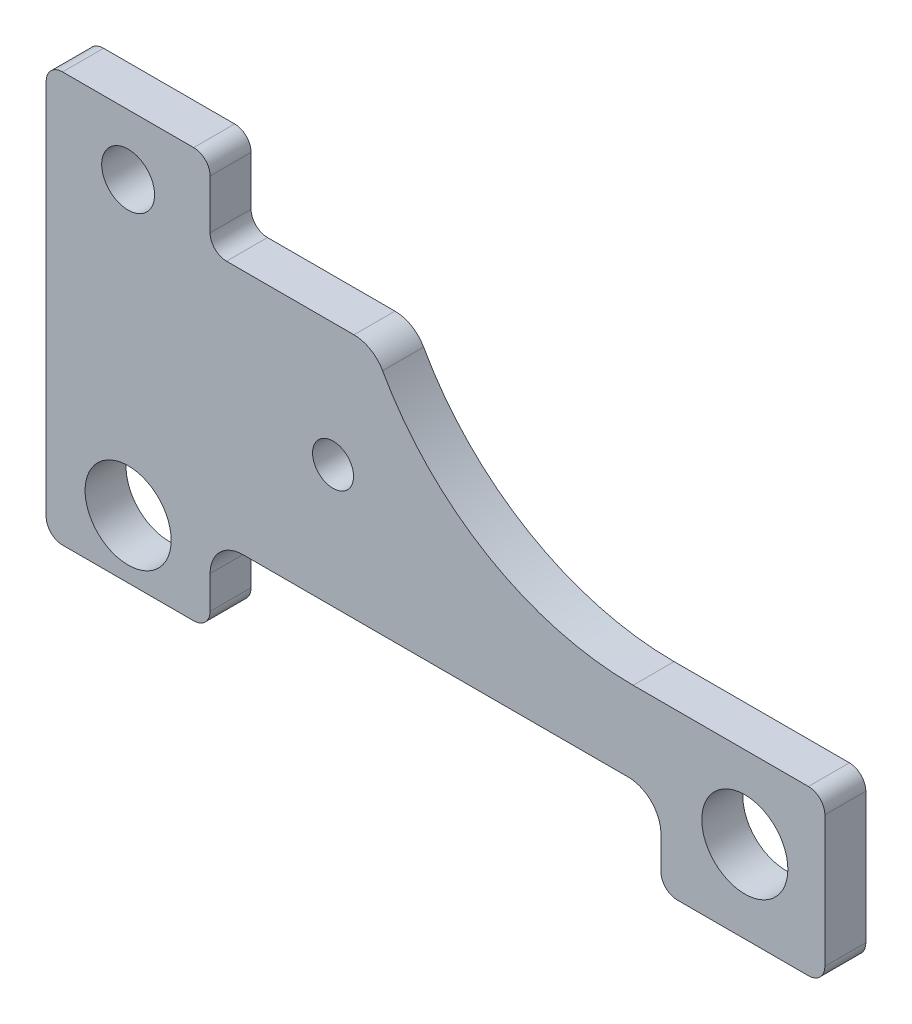
ISO-10303-21;
HEADER;
FILE_DESCRIPTION(('STEP AP214'),'2;1');
FILE_NAME('part.step','',(''),(''),'','','');
FILE_SCHEMA(('AUTOMOTIVE_DESIGN { 1 0 10303 214 1 1 1 1 }'));
ENDSEC;
DATA;
#1=APPLICATION_CONTEXT('core data for automotive mechanical design processes');
#2=APPLICATION_PROTOCOL_DEFINITION('international standard','automotive_design',2000,#1);
#3=PRODUCT_CONTEXT('',#1,'mechanical');
#4=PRODUCT('Part','Part','',(#3));
#5=PRODUCT_RELATED_PRODUCT_CATEGORY('part','',(#4));
#6=PRODUCT_DEFINITION_FORMATION('','',#4);
#7=PRODUCT_DEFINITION_CONTEXT('part definition',#1,'design');
#8=PRODUCT_DEFINITION('design','',#6,#7);
#9=PRODUCT_DEFINITION_SHAPE('','',#8);
#10=(LENGTH_UNIT() NAMED_UNIT(*) SI_UNIT(.MILLI.,.METRE.));
#11=(NAMED_UNIT(*) PLANE_ANGLE_UNIT() SI_UNIT($,.RADIAN.));
#12=(NAMED_UNIT(*) SI_UNIT($,.STERADIAN.) SOLID_ANGLE_UNIT());
#13=UNCERTAINTY_MEASURE_WITH_UNIT(LENGTH_MEASURE(1.E-05),#10,'distance_accuracy_value','');
#14=(GEOMETRIC_REPRESENTATION_CONTEXT(3) GLOBAL_UNCERTAINTY_ASSIGNED_CONTEXT((#13)) GLOBAL_UNIT_ASSIGNED_CONTEXT((#10,
#11,#12)) REPRESENTATION_CONTEXT('',''));
#15=CARTESIAN_POINT('',(0.,0.,0.));
#16=DIRECTION('',(0.,0.,1.));
#17=DIRECTION('',(1.,0.,0.));
#18=AXIS2_PLACEMENT_3D('',#15,#16,#17);
#19=CARTESIAN_POINT('',(31.2380952380952,-14.7142857142857,5.));
#20=DIRECTION('',(0.,0.,-1.));
#21=DIRECTION('',(-1.,0.,0.));
#22=AXIS2_PLACEMENT_3D('',#19,#20,#21);
#23=PLANE('',#22);
#24=DIRECTION('',(1.,0.,0.));
#25=VECTOR('',#24,1.);
#26=CARTESIAN_POINT('',(-15.7619047619047,-10.7142857142857,5.));
#27=LINE('',#26,#25);
#28=CARTESIAN_POINT('',(-15.7619047619047,-10.7142857142857,5.));
#29=VERTEX_POINT('',#28);
#30=CARTESIAN_POINT('',(31.2380952380952,-10.7142857142857,5.));
#31=VERTEX_POINT('',#30);
#32=EDGE_CURVE('E137',#29,#31,#27,.T.);
#33=ORIENTED_EDGE('',*,*,#32,.T.);
#34=CARTESIAN_POINT('',(31.2380952380952,-14.7142857142857,5.));
#35=DIRECTION('',(0.,0.,-1.));
#36=DIRECTION('',(-1.,0.,0.));
#37=AXIS2_PLACEMENT_3D('',#34,#35,#36);
#38=CIRCLE('',#37,4.);
#39=CARTESIAN_POINT('',(35.2380952380952,-14.7142857142857,5.));
#40=VERTEX_POINT('',#39);
#41=EDGE_CURVE('E388',#31,#40,#38,.T.);
#42=ORIENTED_EDGE('',*,*,#41,.T.);
#43=DIRECTION('',(0.,-1.,0.));
#44=VECTOR('',#43,1.);
#45=CARTESIAN_POINT('',(35.2380952380952,-14.7142857142857,5.));
#46=LINE('',#45,#44);
#47=CARTESIAN_POINT('',(35.2380952380952,-18.7142857142857,5.));
#48=VERTEX_POINT('',#47);
#49=EDGE_CURVE('E325',#40,#48,#46,.T.);
#50=ORIENTED_EDGE('',*,*,#49,.T.);
#51=CARTESIAN_POINT('',(37.2380952380952,-18.7142857142857,5.));
#52=DIRECTION('',(0.,0.,1.));
#53=DIRECTION('',(1.,0.,0.));
#54=AXIS2_PLACEMENT_3D('',#51,#52,#53);
#55=CIRCLE('',#54,2.);
#56=CARTESIAN_POINT('',(37.2380952380952,-20.7142857142857,5.));
#57=VERTEX_POINT('',#56);
#58=EDGE_CURVE('E344',#48,#57,#55,.T.);
#59=ORIENTED_EDGE('',*,*,#58,.T.);
#60=DIRECTION('',(1.,0.,0.));
#61=VECTOR('',#60,1.);
#62=CARTESIAN_POINT('',(37.2380952380952,-20.7142857142857,5.));
#63=LINE('',#62,#61);
#64=CARTESIAN_POINT('',(53.2380952380952,-20.7142857142857,5.));
#65=VERTEX_POINT('',#64);
#66=EDGE_CURVE('E341',#57,#65,#63,.T.);
#67=ORIENTED_EDGE('',*,*,#66,.T.);
#68=CARTESIAN_POINT('',(53.2380952380952,-18.7142857142857,5.));
#69=DIRECTION('',(0.,0.,1.));
#70=DIRECTION('',(1.,0.,0.));
#71=AXIS2_PLACEMENT_3D('',#68,#69,#70);
#72=CIRCLE('',#71,2.);
#73=CARTESIAN_POINT('',(55.2380952380952,-18.7142857142857,5.));
#74=VERTEX_POINT('',#73);
#75=EDGE_CURVE('E343',#65,#74,#72,.T.);
#76=ORIENTED_EDGE('',*,*,#75,.T.);
#77=DIRECTION('',(0.,1.,0.));
#78=VECTOR('',#77,1.);
#79=CARTESIAN_POINT('',(55.2380952380952,-2.71428571428572,5.));
#80=LINE('',#79,#78);
#81=CARTESIAN_POINT('',(55.2380952380952,-2.71428571428572,5.));
#82=VERTEX_POINT('',#81);
#83=EDGE_CURVE('E346',#74,#82,#80,.T.);
#84=ORIENTED_EDGE('',*,*,#83,.T.);
#85=CARTESIAN_POINT('',(53.2380952380952,-2.71428571428571,5.));
#86=DIRECTION('',(0.,0.,1.));
#87=DIRECTION('',(-1.,0.,0.));
#88=AXIS2_PLACEMENT_3D('',#85,#86,#87);
#89=CIRCLE('',#88,2.);
#90=CARTESIAN_POINT('',(53.2380952380952,-0.714285714285705,5.));
#91=VERTEX_POINT('',#90);
#92=EDGE_CURVE('E352',#82,#91,#89,.T.);
#93=ORIENTED_EDGE('',*,*,#92,.T.);
#94=DIRECTION('',(-1.,0.,0.));
#95=VECTOR('',#94,1.);
#96=CARTESIAN_POINT('',(31.8478185711456,-0.714285714285702,5.));
#97=LINE('',#96,#95);
#98=CARTESIAN_POINT('',(31.8478185711456,-0.714285714285702,5.));
#99=VERTEX_POINT('',#98);
#100=EDGE_CURVE('E354',#91,#99,#97,.T.);
#101=ORIENTED_EDGE('',*,*,#100,.T.);
#102=CARTESIAN_POINT('',(31.8478185711456,34.2857142857143,5.));
#103=DIRECTION('',(0.,0.,-1.));
#104=DIRECTION('',(1.,0.,0.));
#105=AXIS2_PLACEMENT_3D('',#102,#103,#104);
#106=CIRCLE('',#105,35.);
#107=CARTESIAN_POINT('',(1.28225329897002,17.2344322344323,5.));
#108=VERTEX_POINT('',#107);
#109=EDGE_CURVE('E356',#99,#108,#106,.T.);
#110=ORIENTED_EDGE('',*,*,#109,.T.);
#111=CARTESIAN_POINT('',(-2.21095416070719,15.2857142857143,5.));
#112=DIRECTION('',(0.,0.,1.));
#113=DIRECTION('',(-1.,0.,0.));
#114=AXIS2_PLACEMENT_3D('',#111,#112,#113);
#115=CIRCLE('',#114,4.);
#116=CARTESIAN_POINT('',(-2.21095416070719,19.2857142857143,5.));
#117=VERTEX_POINT('',#116);
#118=EDGE_CURVE('E358',#108,#117,#115,.T.);
#119=ORIENTED_EDGE('',*,*,#118,.T.);
#120=DIRECTION('',(-1.,0.,0.));
#121=VECTOR('',#120,1.);
#122=CARTESIAN_POINT('',(-17.7619047619048,19.2857142857143,5.));
#123=LINE('',#122,#121);
#124=CARTESIAN_POINT('',(-17.7619047619048,19.2857142857143,5.));
#125=VERTEX_POINT('',#124);
#126=EDGE_CURVE('E360',#117,#125,#123,.T.);
#127=ORIENTED_EDGE('',*,*,#126,.T.);
#128=CARTESIAN_POINT('',(-17.7619047619048,21.2857142857143,5.));
#129=DIRECTION('',(0.,0.,-1.));
#130=DIRECTION('',(-1.,0.,0.));
#131=AXIS2_PLACEMENT_3D('',#128,#129,#130);
#132=CIRCLE('',#131,2.);
#133=CARTESIAN_POINT('',(-19.7619047619048,21.2857142857143,5.));
#134=VERTEX_POINT('',#133);
#135=EDGE_CURVE('E362',#125,#134,#132,.T.);
#136=ORIENTED_EDGE('',*,*,#135,.T.);
#137=DIRECTION('',(0.,1.,0.));
#138=VECTOR('',#137,1.);
#139=CARTESIAN_POINT('',(-19.7619047619048,27.2857142857143,5.));
#140=LINE('',#139,#138);
#141=CARTESIAN_POINT('',(-19.7619047619048,27.2857142857143,5.));
#142=VERTEX_POINT('',#141);
#143=EDGE_CURVE('E364',#134,#142,#140,.T.);
#144=ORIENTED_EDGE('',*,*,#143,.T.);
#145=CARTESIAN_POINT('',(-21.7619047619048,27.2857142857143,5.));
#146=DIRECTION('',(0.,0.,1.));
#147=DIRECTION('',(-1.,0.,0.));
#148=AXIS2_PLACEMENT_3D('',#145,#146,#147);
#149=CIRCLE('',#148,2.);
#150=CARTESIAN_POINT('',(-21.7619047619048,29.2857142857143,5.));
#151=VERTEX_POINT('',#150);
#152=EDGE_CURVE('E366',#142,#151,#149,.T.);
#153=ORIENTED_EDGE('',*,*,#152,.T.);
#154=DIRECTION('',(-1.,0.,0.));
#155=VECTOR('',#154,1.);
#156=CARTESIAN_POINT('',(-37.7619047619048,29.2857142857143,5.));
#157=LINE('',#156,#155);
#158=CARTESIAN_POINT('',(-37.7619047619048,29.2857142857143,5.));
#159=VERTEX_POINT('',#158);
#160=EDGE_CURVE('E368',#151,#159,#157,.T.);
#161=ORIENTED_EDGE('',*,*,#160,.T.);
#162=CARTESIAN_POINT('',(-37.7619047619048,27.2857142857143,5.));
#163=DIRECTION('',(0.,0.,1.));
#164=DIRECTION('',(1.,0.,0.));
#165=AXIS2_PLACEMENT_3D('',#162,#163,#164);
#166=CIRCLE('',#165,2.);
#167=CARTESIAN_POINT('',(-39.7619047619048,27.2857142857143,5.));
#168=VERTEX_POINT('',#167);
#169=EDGE_CURVE('E370',#159,#168,#166,.T.);
#170=ORIENTED_EDGE('',*,*,#169,.T.);
#171=DIRECTION('',(0.,-1.,0.));
#172=VECTOR('',#171,1.);
#173=CARTESIAN_POINT('',(-39.7619047619048,27.2857142857143,5.));
#174=LINE('',#173,#172);
#175=CARTESIAN_POINT('',(-39.7619047619048,-18.7142857142857,5.));
#176=VERTEX_POINT('',#175);
#177=EDGE_CURVE('E372',#168,#176,#174,.T.);
#178=ORIENTED_EDGE('',*,*,#177,.T.);
#179=CARTESIAN_POINT('',(-37.7619047619048,-18.7142857142857,5.));
#180=DIRECTION('',(0.,0.,1.));
#181=DIRECTION('',(1.,0.,0.));
#182=AXIS2_PLACEMENT_3D('',#179,#180,#181);
#183=CIRCLE('',#182,2.);
#184=CARTESIAN_POINT('',(-37.7619047619047,-20.7142857142857,5.));
#185=VERTEX_POINT('',#184);
#186=EDGE_CURVE('E374',#176,#185,#183,.T.);
#187=ORIENTED_EDGE('',*,*,#186,.T.);
#188=DIRECTION('',(1.,0.,0.));
#189=VECTOR('',#188,1.);
#190=CARTESIAN_POINT('',(-37.7619047619047,-20.7142857142857,5.));
#191=LINE('',#190,#189);
#192=CARTESIAN_POINT('',(-21.7619047619048,-20.7142857142857,5.));
#193=VERTEX_POINT('',#192);
#194=EDGE_CURVE('E202',#185,#193,#191,.T.);
#195=ORIENTED_EDGE('',*,*,#194,.T.);
#196=CARTESIAN_POINT('',(-21.7619047619048,-18.7142857142857,5.));
#197=DIRECTION('',(0.,0.,1.));
#198=DIRECTION('',(1.,0.,0.));
#199=AXIS2_PLACEMENT_3D('',#196,#197,#198);
#200=CIRCLE('',#199,2.);
#201=CARTESIAN_POINT('',(-19.7619047619048,-18.7142857142857,5.));
#202=VERTEX_POINT('',#201);
#203=EDGE_CURVE('E196',#193,#202,#200,.T.);
#204=ORIENTED_EDGE('',*,*,#203,.T.);
#205=DIRECTION('',(0.,1.,0.));
#206=VECTOR('',#205,1.);
#207=CARTESIAN_POINT('',(-19.7619047619048,-14.7142857142857,5.));
#208=LINE('',#207,#206);
#209=CARTESIAN_POINT('',(-19.7619047619048,-14.7142857142857,5.));
#210=VERTEX_POINT('',#209);
#211=EDGE_CURVE('E200',#202,#210,#208,.T.);
#212=ORIENTED_EDGE('',*,*,#211,.T.);
#213=CARTESIAN_POINT('',(-15.7619047619048,-14.7142857142857,5.));
#214=DIRECTION('',(0.,0.,-1.));
#215=DIRECTION('',(-1.,0.,0.));
#216=AXIS2_PLACEMENT_3D('',#213,#214,#215);
#217=CIRCLE('',#216,4.);
#218=EDGE_CURVE('E50',#210,#29,#217,.T.);
#219=ORIENTED_EDGE('',*,*,#218,.T.);
#220=EDGE_LOOP('',(#33,#42,#50,#59,#67,#76,#84,#93,#101,#110,#119,#127,#136,#144,#153,#161,#170,
#178,#187,#195,#204,#212,#219));
#221=FACE_BOUND('',#220,.T.);
#222=CARTESIAN_POINT('',(-29.7619047619048,-13.5714285714286,5.));
#223=DIRECTION('',(0.,0.,1.));
#224=DIRECTION('',(1.,0.,0.));
#225=AXIS2_PLACEMENT_3D('',#222,#223,#224);
#226=CIRCLE('',#225,5.25);
#227=CARTESIAN_POINT('',(-24.5119047619048,-13.5714285714286,5.));
#228=VERTEX_POINT('',#227);
#229=EDGE_CURVE('E222',#228,#228,#226,.T.);
#230=ORIENTED_EDGE('',*,*,#229,.F.);
#231=EDGE_LOOP('',(#230));
#232=FACE_BOUND('',#231,.T.);
#233=CARTESIAN_POINT('',(-29.7619047619048,21.9047619047619,5.));
#234=DIRECTION('',(0.,0.,1.));
#235=DIRECTION('',(1.,0.,0.));
#236=AXIS2_PLACEMENT_3D('',#233,#234,#235);
#237=CIRCLE('',#236,3.225);
#238=CARTESIAN_POINT('',(-26.5369047619048,21.9047619047619,5.));
#239=VERTEX_POINT('',#238);
#240=EDGE_CURVE('E681',#239,#239,#237,.T.);
#241=ORIENTED_EDGE('',*,*,#240,.F.);
#242=EDGE_LOOP('',(#241));
#243=FACE_BOUND('',#242,.T.);
#244=CARTESIAN_POINT('',(-4.76190476190476,4.2857142857143,5.));
#245=DIRECTION('',(0.,0.,1.));
#246=DIRECTION('',(1.,0.,0.));
#247=AXIS2_PLACEMENT_3D('',#244,#245,#246);
#248=CIRCLE('',#247,2.5);
#249=CARTESIAN_POINT('',(-2.26190476190476,4.2857142857143,5.));
#250=VERTEX_POINT('',#249);
#251=EDGE_CURVE('E675',#250,#250,#248,.T.);
#252=ORIENTED_EDGE('',*,*,#251,.F.);
#253=EDGE_LOOP('',(#252));
#254=FACE_BOUND('',#253,.T.);
#255=CARTESIAN_POINT('',(45.4761904761905,-10.7142857142857,5.));
#256=DIRECTION('',(0.,0.,1.));
#257=DIRECTION('',(1.,0.,0.));
#258=AXIS2_PLACEMENT_3D('',#255,#256,#257);
#259=CIRCLE('',#258,5.25);
#260=CARTESIAN_POINT('',(50.7261904761905,-10.7142857142857,5.));
#261=VERTEX_POINT('',#260);
#262=EDGE_CURVE('E666',#261,#261,#259,.T.);
#263=ORIENTED_EDGE('',*,*,#262,.F.);
#264=EDGE_LOOP('',(#263));
#265=FACE_BOUND('',#264,.T.);
#266=ADVANCED_FACE('F33',(#221,#232,#243,#254,#265),#23,.F.);
#267=CARTESIAN_POINT('',(31.2380952380952,-14.7142857142857,0.));
#268=DIRECTION('',(0.,0.,-1.));
#269=DIRECTION('',(-1.,0.,0.));
#270=AXIS2_PLACEMENT_3D('',#267,#268,#269);
#271=PLANE('',#270);
#272=CARTESIAN_POINT('',(-4.76190476190476,4.2857142857143,0.));
#273=DIRECTION('',(0.,0.,1.));
#274=DIRECTION('',(1.,0.,0.));
#275=AXIS2_PLACEMENT_3D('',#272,#273,#274);
#276=CIRCLE('',#275,2.5);
#277=CARTESIAN_POINT('',(-2.26190476190476,4.2857142857143,0.));
#278=VERTEX_POINT('',#277);
#279=EDGE_CURVE('E672',#278,#278,#276,.T.);
#280=ORIENTED_EDGE('',*,*,#279,.T.);
#281=EDGE_LOOP('',(#280));
#282=FACE_BOUND('',#281,.T.);
#283=CARTESIAN_POINT('',(-29.7619047619048,-13.5714285714286,0.));
#284=DIRECTION('',(0.,0.,1.));
#285=DIRECTION('',(1.,0.,0.));
#286=AXIS2_PLACEMENT_3D('',#283,#284,#285);
#287=CIRCLE('',#286,5.25);
#288=CARTESIAN_POINT('',(-24.5119047619048,-13.5714285714286,0.));
#289=VERTEX_POINT('',#288);
#290=EDGE_CURVE('E392',#289,#289,#287,.T.);
#291=ORIENTED_EDGE('',*,*,#290,.T.);
#292=EDGE_LOOP('',(#291));
#293=FACE_BOUND('',#292,.T.);
#294=DIRECTION('',(1.,0.,0.));
#295=VECTOR('',#294,1.);
#296=CARTESIAN_POINT('',(0.238095238095242,-10.7142857142857,0.));
#297=LINE('',#296,#295);
#298=CARTESIAN_POINT('',(-15.7619047619047,-10.7142857142857,0.));
#299=VERTEX_POINT('',#298);
#300=CARTESIAN_POINT('',(31.2380952380952,-10.7142857142857,0.));
#301=VERTEX_POINT('',#300);
#302=EDGE_CURVE('E131',#299,#301,#297,.T.);
#303=ORIENTED_EDGE('',*,*,#302,.F.);
#304=CARTESIAN_POINT('',(-15.7619047619048,-14.7142857142857,0.));
#305=DIRECTION('',(0.,0.,-1.));
#306=DIRECTION('',(-1.,0.,0.));
#307=AXIS2_PLACEMENT_3D('',#304,#305,#306);
#308=CIRCLE('',#307,4.);
#309=CARTESIAN_POINT('',(-19.7619047619048,-14.7142857142857,0.));
#310=VERTEX_POINT('',#309);
#311=EDGE_CURVE('E262',#310,#299,#308,.T.);
#312=ORIENTED_EDGE('',*,*,#311,.F.);
#313=DIRECTION('',(0.,1.,0.));
#314=VECTOR('',#313,1.);
#315=CARTESIAN_POINT('',(-19.7619047619048,-14.7142857142857,0.));
#316=LINE('',#315,#314);
#317=CARTESIAN_POINT('',(-19.7619047619048,-18.7142857142857,0.));
#318=VERTEX_POINT('',#317);
#319=EDGE_CURVE('E124',#318,#310,#316,.T.);
#320=ORIENTED_EDGE('',*,*,#319,.F.);
#321=CARTESIAN_POINT('',(-21.7619047619048,-18.7142857142857,0.));
#322=DIRECTION('',(0.,0.,1.));
#323=DIRECTION('',(1.,0.,0.));
#324=AXIS2_PLACEMENT_3D('',#321,#322,#323);
#325=CIRCLE('',#324,2.);
#326=CARTESIAN_POINT('',(-21.7619047619048,-20.7142857142857,0.));
#327=VERTEX_POINT('',#326);
#328=EDGE_CURVE('E210',#327,#318,#325,.T.);
#329=ORIENTED_EDGE('',*,*,#328,.F.);
#330=DIRECTION('',(1.,0.,0.));
#331=VECTOR('',#330,1.);
#332=CARTESIAN_POINT('',(-37.7619047619047,-20.7142857142857,0.));
#333=LINE('',#332,#331);
#334=CARTESIAN_POINT('',(-37.7619047619047,-20.7142857142857,0.));
#335=VERTEX_POINT('',#334);
#336=EDGE_CURVE('E258',#335,#327,#333,.T.);
#337=ORIENTED_EDGE('',*,*,#336,.F.);
#338=CARTESIAN_POINT('',(-37.7619047619048,-18.7142857142857,0.));
#339=DIRECTION('',(0.,0.,1.));
#340=DIRECTION('',(1.,0.,0.));
#341=AXIS2_PLACEMENT_3D('',#338,#339,#340);
#342=CIRCLE('',#341,2.);
#343=CARTESIAN_POINT('',(-39.7619047619048,-18.7142857142857,0.));
#344=VERTEX_POINT('',#343);
#345=EDGE_CURVE('E256',#344,#335,#342,.T.);
#346=ORIENTED_EDGE('',*,*,#345,.F.);
#347=DIRECTION('',(0.,-1.,0.));
#348=VECTOR('',#347,1.);
#349=CARTESIAN_POINT('',(-39.7619047619048,27.2857142857143,0.));
#350=LINE('',#349,#348);
#351=CARTESIAN_POINT('',(-39.7619047619048,27.2857142857143,0.));
#352=VERTEX_POINT('',#351);
#353=EDGE_CURVE('E254',#352,#344,#350,.T.);
#354=ORIENTED_EDGE('',*,*,#353,.F.);
#355=CARTESIAN_POINT('',(-37.7619047619048,27.2857142857143,0.));
#356=DIRECTION('',(0.,0.,1.));
#357=DIRECTION('',(1.,0.,0.));
#358=AXIS2_PLACEMENT_3D('',#355,#356,#357);
#359=CIRCLE('',#358,2.);
#360=CARTESIAN_POINT('',(-37.7619047619048,29.2857142857143,0.));
#361=VERTEX_POINT('',#360);
#362=EDGE_CURVE('E252',#361,#352,#359,.T.);
#363=ORIENTED_EDGE('',*,*,#362,.F.);
#364=DIRECTION('',(-1.,0.,0.));
#365=VECTOR('',#364,1.);
#366=CARTESIAN_POINT('',(-37.7619047619048,29.2857142857143,0.));
#367=LINE('',#366,#365);
#368=CARTESIAN_POINT('',(-21.7619047619048,29.2857142857143,0.));
#369=VERTEX_POINT('',#368);
#370=EDGE_CURVE('E250',#369,#361,#367,.T.);
#371=ORIENTED_EDGE('',*,*,#370,.F.);
#372=CARTESIAN_POINT('',(-21.7619047619048,27.2857142857143,0.));
#373=DIRECTION('',(0.,0.,1.));
#374=DIRECTION('',(-1.,0.,0.));
#375=AXIS2_PLACEMENT_3D('',#372,#373,#374);
#376=CIRCLE('',#375,2.);
#377=CARTESIAN_POINT('',(-19.7619047619048,27.2857142857143,0.));
#378=VERTEX_POINT('',#377);
#379=EDGE_CURVE('E248',#378,#369,#376,.T.);
#380=ORIENTED_EDGE('',*,*,#379,.F.);
#381=DIRECTION('',(0.,1.,0.));
#382=VECTOR('',#381,1.);
#383=CARTESIAN_POINT('',(-19.7619047619048,27.2857142857143,0.));
#384=LINE('',#383,#382);
#385=CARTESIAN_POINT('',(-19.7619047619048,21.2857142857143,0.));
#386=VERTEX_POINT('',#385);
#387=EDGE_CURVE('E246',#386,#378,#384,.T.);
#388=ORIENTED_EDGE('',*,*,#387,.F.);
#389=CARTESIAN_POINT('',(-17.7619047619048,21.2857142857143,0.));
#390=DIRECTION('',(0.,0.,-1.));
#391=DIRECTION('',(-1.,0.,0.));
#392=AXIS2_PLACEMENT_3D('',#389,#390,#391);
#393=CIRCLE('',#392,2.);
#394=CARTESIAN_POINT('',(-17.7619047619048,19.2857142857143,0.));
#395=VERTEX_POINT('',#394);
#396=EDGE_CURVE('E244',#395,#386,#393,.T.);
#397=ORIENTED_EDGE('',*,*,#396,.F.);
#398=DIRECTION('',(-1.,0.,0.));
#399=VECTOR('',#398,1.);
#400=CARTESIAN_POINT('',(-17.7619047619048,19.2857142857143,0.));
#401=LINE('',#400,#399);
#402=CARTESIAN_POINT('',(-2.21095416070719,19.2857142857143,0.));
#403=VERTEX_POINT('',#402);
#404=EDGE_CURVE('E242',#403,#395,#401,.T.);
#405=ORIENTED_EDGE('',*,*,#404,.F.);
#406=CARTESIAN_POINT('',(-2.21095416070719,15.2857142857143,0.));
#407=DIRECTION('',(0.,0.,1.));
#408=DIRECTION('',(-1.,0.,0.));
#409=AXIS2_PLACEMENT_3D('',#406,#407,#408);
#410=CIRCLE('',#409,4.);
#411=CARTESIAN_POINT('',(1.28225329897002,17.2344322344323,0.));
#412=VERTEX_POINT('',#411);
#413=EDGE_CURVE('E240',#412,#403,#410,.T.);
#414=ORIENTED_EDGE('',*,*,#413,.F.);
#415=CARTESIAN_POINT('',(31.8478185711456,34.2857142857143,0.));
#416=DIRECTION('',(0.,0.,-1.));
#417=DIRECTION('',(1.,0.,0.));
#418=AXIS2_PLACEMENT_3D('',#415,#416,#417);
#419=CIRCLE('',#418,35.);
#420=CARTESIAN_POINT('',(31.8478185711456,-0.714285714285702,0.));
#421=VERTEX_POINT('',#420);
#422=EDGE_CURVE('E238',#421,#412,#419,.T.);
#423=ORIENTED_EDGE('',*,*,#422,.F.);
#424=DIRECTION('',(-1.,0.,0.));
#425=VECTOR('',#424,1.);
#426=CARTESIAN_POINT('',(31.8478185711456,-0.714285714285702,0.));
#427=LINE('',#426,#425);
#428=CARTESIAN_POINT('',(53.2380952380952,-0.714285714285705,0.));
#429=VERTEX_POINT('',#428);
#430=EDGE_CURVE('E236',#429,#421,#427,.T.);
#431=ORIENTED_EDGE('',*,*,#430,.F.);
#432=CARTESIAN_POINT('',(53.2380952380952,-2.71428571428571,0.));
#433=DIRECTION('',(0.,0.,1.));
#434=DIRECTION('',(-1.,0.,0.));
#435=AXIS2_PLACEMENT_3D('',#432,#433,#434);
#436=CIRCLE('',#435,2.);
#437=CARTESIAN_POINT('',(55.2380952380952,-2.71428571428572,0.));
#438=VERTEX_POINT('',#437);
#439=EDGE_CURVE('E234',#438,#429,#436,.T.);
#440=ORIENTED_EDGE('',*,*,#439,.F.);
#441=DIRECTION('',(0.,1.,0.));
#442=VECTOR('',#441,1.);
#443=CARTESIAN_POINT('',(55.2380952380952,-2.71428571428572,0.));
#444=LINE('',#443,#442);
#445=CARTESIAN_POINT('',(55.2380952380952,-18.7142857142857,0.));
#446=VERTEX_POINT('',#445);
#447=EDGE_CURVE('E232',#446,#438,#444,.T.);
#448=ORIENTED_EDGE('',*,*,#447,.F.);
#449=CARTESIAN_POINT('',(53.2380952380952,-18.7142857142857,0.));
#450=DIRECTION('',(0.,0.,1.));
#451=DIRECTION('',(1.,0.,0.));
#452=AXIS2_PLACEMENT_3D('',#449,#450,#451);
#453=CIRCLE('',#452,2.);
#454=CARTESIAN_POINT('',(53.2380952380952,-20.7142857142857,0.));
#455=VERTEX_POINT('',#454);
#456=EDGE_CURVE('E230',#455,#446,#453,.T.);
#457=ORIENTED_EDGE('',*,*,#456,.F.);
#458=DIRECTION('',(1.,0.,0.));
#459=VECTOR('',#458,1.);
#460=CARTESIAN_POINT('',(37.2380952380952,-20.7142857142857,0.));
#461=LINE('',#460,#459);
#462=CARTESIAN_POINT('',(37.2380952380952,-20.7142857142857,0.));
#463=VERTEX_POINT('',#462);
#464=EDGE_CURVE('E228',#463,#455,#461,.T.);
#465=ORIENTED_EDGE('',*,*,#464,.F.);
#466=CARTESIAN_POINT('',(37.2380952380952,-18.7142857142857,0.));
#467=DIRECTION('',(0.,0.,1.));
#468=DIRECTION('',(1.,0.,0.));
#469=AXIS2_PLACEMENT_3D('',#466,#467,#468);
#470=CIRCLE('',#469,2.);
#471=CARTESIAN_POINT('',(35.2380952380952,-18.7142857142857,0.));
#472=VERTEX_POINT('',#471);
#473=EDGE_CURVE('E226',#472,#463,#470,.T.);
#474=ORIENTED_EDGE('',*,*,#473,.F.);
#475=DIRECTION('',(0.,-1.,0.));
#476=VECTOR('',#475,1.);
#477=CARTESIAN_POINT('',(35.2380952380952,-14.7142857142857,0.));
#478=LINE('',#477,#476);
#479=CARTESIAN_POINT('',(35.2380952380952,-14.7142857142857,0.));
#480=VERTEX_POINT('',#479);
#481=EDGE_CURVE('E224',#480,#472,#478,.T.);
#482=ORIENTED_EDGE('',*,*,#481,.F.);
#483=CARTESIAN_POINT('',(31.2380952380952,-14.7142857142857,0.));
#484=DIRECTION('',(0.,0.,-1.));
#485=DIRECTION('',(-1.,0.,0.));
#486=AXIS2_PLACEMENT_3D('',#483,#484,#485);
#487=CIRCLE('',#486,4.);
#488=EDGE_CURVE('E221',#301,#480,#487,.T.);
#489=ORIENTED_EDGE('',*,*,#488,.F.);
#490=EDGE_LOOP('',(#303,#312,#320,#329,#337,#346,#354,#363,#371,#380,#388,#397,#405,#414,#423,
#431,#440,#448,#457,#465,#474,#482,#489));
#491=FACE_BOUND('',#490,.T.);
#492=CARTESIAN_POINT('',(-29.7619047619048,21.9047619047619,0.));
#493=DIRECTION('',(0.,0.,1.));
#494=DIRECTION('',(1.,0.,0.));
#495=AXIS2_PLACEMENT_3D('',#492,#493,#494);
#496=CIRCLE('',#495,3.225);
#497=CARTESIAN_POINT('',(-26.5369047619048,21.9047619047619,0.));
#498=VERTEX_POINT('',#497);
#499=EDGE_CURVE('E678',#498,#498,#496,.T.);
#500=ORIENTED_EDGE('',*,*,#499,.T.);
#501=EDGE_LOOP('',(#500));
#502=FACE_BOUND('',#501,.T.);
#503=CARTESIAN_POINT('',(45.4761904761905,-10.7142857142857,0.));
#504=DIRECTION('',(0.,0.,1.));
#505=DIRECTION('',(1.,0.,0.));
#506=AXIS2_PLACEMENT_3D('',#503,#504,#505);
#507=CIRCLE('',#506,5.25);
#508=CARTESIAN_POINT('',(50.7261904761905,-10.7142857142857,0.));
#509=VERTEX_POINT('',#508);
#510=EDGE_CURVE('E669',#509,#509,#507,.T.);
#511=ORIENTED_EDGE('',*,*,#510,.T.);
#512=EDGE_LOOP('',(#511));
#513=FACE_BOUND('',#512,.T.);
#514=ADVANCED_FACE('F329',(#282,#293,#491,#502,#513),#271,.T.);
#515=CARTESIAN_POINT('',(0.238095238095242,-10.7142857142857,5.));
#516=DIRECTION('',(0.,1.,0.));
#517=DIRECTION('',(-1.,0.,0.));
#518=AXIS2_PLACEMENT_3D('',#515,#516,#517);
#519=PLANE('',#518);
#520=ORIENTED_EDGE('',*,*,#302,.T.);
#521=DIRECTION('',(0.,0.,-1.));
#522=VECTOR('',#521,1.);
#523=CARTESIAN_POINT('',(31.2380952380952,-10.7142857142857,5.));
#524=LINE('',#523,#522);
#525=EDGE_CURVE('E11',#31,#301,#524,.T.);
#526=ORIENTED_EDGE('',*,*,#525,.F.);
#527=ORIENTED_EDGE('',*,*,#32,.F.);
#528=DIRECTION('',(0.,0.,-1.));
#529=VECTOR('',#528,1.);
#530=CARTESIAN_POINT('',(-15.7619047619047,-10.7142857142857,5.));
#531=LINE('',#530,#529);
#532=EDGE_CURVE('E216',#29,#299,#531,.T.);
#533=ORIENTED_EDGE('',*,*,#532,.T.);
#534=EDGE_LOOP('',(#520,#526,#527,#533));
#535=FACE_BOUND('',#534,.T.);
#536=ADVANCED_FACE('F35',(#535),#519,.F.);
#537=CARTESIAN_POINT('',(31.2380952380952,-14.7142857142857,5.));
#538=DIRECTION('',(0.,0.,-1.));
#539=DIRECTION('',(-1.,0.,0.));
#540=AXIS2_PLACEMENT_3D('',#537,#538,#539);
#541=CYLINDRICAL_SURFACE('',#540,4.);
#542=ORIENTED_EDGE('',*,*,#488,.T.);
#543=DIRECTION('',(0.,0.,-1.));
#544=VECTOR('',#543,1.);
#545=CARTESIAN_POINT('',(35.2380952380952,-14.7142857142857,5.));
#546=LINE('',#545,#544);
#547=EDGE_CURVE('E42',#40,#480,#546,.T.);
#548=ORIENTED_EDGE('',*,*,#547,.F.);
#549=ORIENTED_EDGE('',*,*,#41,.F.);
#550=ORIENTED_EDGE('',*,*,#525,.T.);
#551=EDGE_LOOP('',(#542,#548,#549,#550));
#552=FACE_BOUND('',#551,.T.);
#553=ADVANCED_FACE('F394',(#552),#541,.F.);
#554=CARTESIAN_POINT('',(35.2380952380952,-14.7142857142857,5.));
#555=DIRECTION('',(1.,0.,0.));
#556=DIRECTION('',(0.,0.,-1.));
#557=AXIS2_PLACEMENT_3D('',#554,#555,#556);
#558=PLANE('',#557);
#559=ORIENTED_EDGE('',*,*,#481,.T.);
#560=DIRECTION('',(0.,0.,-1.));
#561=VECTOR('',#560,1.);
#562=CARTESIAN_POINT('',(35.2380952380952,-18.7142857142857,5.));
#563=LINE('',#562,#561);
#564=EDGE_CURVE('E316',#48,#472,#563,.T.);
#565=ORIENTED_EDGE('',*,*,#564,.F.);
#566=ORIENTED_EDGE('',*,*,#49,.F.);
#567=ORIENTED_EDGE('',*,*,#547,.T.);
#568=EDGE_LOOP('',(#559,#565,#566,#567));
#569=FACE_BOUND('',#568,.T.);
#570=ADVANCED_FACE('F323',(#569),#558,.F.);
#571=CARTESIAN_POINT('',(37.2380952380952,-18.7142857142857,5.));
#572=DIRECTION('',(0.,0.,-1.));
#573=DIRECTION('',(-1.,0.,0.));
#574=AXIS2_PLACEMENT_3D('',#571,#572,#573);
#575=CYLINDRICAL_SURFACE('',#574,2.);
#576=ORIENTED_EDGE('',*,*,#473,.T.);
#577=DIRECTION('',(0.,0.,-1.));
#578=VECTOR('',#577,1.);
#579=CARTESIAN_POINT('',(37.2380952380952,-20.7142857142857,5.));
#580=LINE('',#579,#578);
#581=EDGE_CURVE('E313',#57,#463,#580,.T.);
#582=ORIENTED_EDGE('',*,*,#581,.F.);
#583=ORIENTED_EDGE('',*,*,#58,.F.);
#584=ORIENTED_EDGE('',*,*,#564,.T.);
#585=EDGE_LOOP('',(#576,#582,#583,#584));
#586=FACE_BOUND('',#585,.T.);
#587=ADVANCED_FACE('F335',(#586),#575,.T.);
#588=CARTESIAN_POINT('',(37.2380952380952,-20.7142857142857,5.));
#589=DIRECTION('',(0.,1.,0.));
#590=DIRECTION('',(-1.,0.,0.));
#591=AXIS2_PLACEMENT_3D('',#588,#589,#590);
#592=PLANE('',#591);
#593=ORIENTED_EDGE('',*,*,#464,.T.);
#594=DIRECTION('',(0.,0.,-1.));
#595=VECTOR('',#594,1.);
#596=CARTESIAN_POINT('',(53.2380952380952,-20.7142857142857,5.));
#597=LINE('',#596,#595);
#598=EDGE_CURVE('E310',#65,#455,#597,.T.);
#599=ORIENTED_EDGE('',*,*,#598,.F.);
#600=ORIENTED_EDGE('',*,*,#66,.F.);
#601=ORIENTED_EDGE('',*,*,#581,.T.);
#602=EDGE_LOOP('',(#593,#599,#600,#601));
#603=FACE_BOUND('',#602,.T.);
#604=ADVANCED_FACE('F339',(#603),#592,.F.);
#605=CARTESIAN_POINT('',(53.2380952380952,-18.7142857142857,5.));
#606=DIRECTION('',(0.,0.,-1.));
#607=DIRECTION('',(-1.,0.,0.));
#608=AXIS2_PLACEMENT_3D('',#605,#606,#607);
#609=CYLINDRICAL_SURFACE('',#608,2.);
#610=ORIENTED_EDGE('',*,*,#456,.T.);
#611=DIRECTION('',(0.,0.,-1.));
#612=VECTOR('',#611,1.);
#613=CARTESIAN_POINT('',(55.2380952380952,-18.7142857142857,5.));
#614=LINE('',#613,#612);
#615=EDGE_CURVE('E307',#74,#446,#614,.T.);
#616=ORIENTED_EDGE('',*,*,#615,.F.);
#617=ORIENTED_EDGE('',*,*,#75,.F.);
#618=ORIENTED_EDGE('',*,*,#598,.T.);
#619=EDGE_LOOP('',(#610,#616,#617,#618));
#620=FACE_BOUND('',#619,.T.);
#621=ADVANCED_FACE('F469',(#620),#609,.T.);
#622=CARTESIAN_POINT('',(55.2380952380952,-2.71428571428572,5.));
#623=DIRECTION('',(-1.,0.,0.));
#624=DIRECTION('',(0.,0.,1.));
#625=AXIS2_PLACEMENT_3D('',#622,#623,#624);
#626=PLANE('',#625);
#627=ORIENTED_EDGE('',*,*,#447,.T.);
#628=DIRECTION('',(0.,0.,-1.));
#629=VECTOR('',#628,1.);
#630=CARTESIAN_POINT('',(55.2380952380952,-2.71428571428572,5.));
#631=LINE('',#630,#629);
#632=EDGE_CURVE('E304',#82,#438,#631,.T.);
#633=ORIENTED_EDGE('',*,*,#632,.F.);
#634=ORIENTED_EDGE('',*,*,#83,.F.);
#635=ORIENTED_EDGE('',*,*,#615,.T.);
#636=EDGE_LOOP('',(#627,#633,#634,#635));
#637=FACE_BOUND('',#636,.T.);
#638=ADVANCED_FACE('F465',(#637),#626,.F.);
#639=CARTESIAN_POINT('',(53.2380952380952,-2.71428571428571,5.));
#640=DIRECTION('',(0.,0.,-1.));
#641=DIRECTION('',(-1.,0.,0.));
#642=AXIS2_PLACEMENT_3D('',#639,#640,#641);
#643=CYLINDRICAL_SURFACE('',#642,2.);
#644=ORIENTED_EDGE('',*,*,#439,.T.);
#645=DIRECTION('',(0.,0.,-1.));
#646=VECTOR('',#645,1.);
#647=CARTESIAN_POINT('',(53.2380952380952,-0.714285714285705,5.));
#648=LINE('',#647,#646);
#649=EDGE_CURVE('E301',#91,#429,#648,.T.);
#650=ORIENTED_EDGE('',*,*,#649,.F.);
#651=ORIENTED_EDGE('',*,*,#92,.F.);
#652=ORIENTED_EDGE('',*,*,#632,.T.);
#653=EDGE_LOOP('',(#644,#650,#651,#652));
#654=FACE_BOUND('',#653,.T.);
#655=ADVANCED_FACE('F461',(#654),#643,.T.);
#656=CARTESIAN_POINT('',(31.8478185711456,-0.714285714285702,5.));
#657=DIRECTION('',(0.,-1.,0.));
#658=DIRECTION('',(1.,0.,0.));
#659=AXIS2_PLACEMENT_3D('',#656,#657,#658);
#660=PLANE('',#659);
#661=ORIENTED_EDGE('',*,*,#430,.T.);
#662=DIRECTION('',(0.,0.,-1.));
#663=VECTOR('',#662,1.);
#664=CARTESIAN_POINT('',(31.8478185711456,-0.714285714285702,5.));
#665=LINE('',#664,#663);
#666=EDGE_CURVE('E298',#99,#421,#665,.T.);
#667=ORIENTED_EDGE('',*,*,#666,.F.);
#668=ORIENTED_EDGE('',*,*,#100,.F.);
#669=ORIENTED_EDGE('',*,*,#649,.T.);
#670=EDGE_LOOP('',(#661,#667,#668,#669));
#671=FACE_BOUND('',#670,.T.);
#672=ADVANCED_FACE('F457',(#671),#660,.F.);
#673=CARTESIAN_POINT('',(31.8478185711456,34.2857142857143,5.));
#674=DIRECTION('',(0.,0.,-1.));
#675=DIRECTION('',(-1.,0.,0.));
#676=AXIS2_PLACEMENT_3D('',#673,#674,#675);
#677=CYLINDRICAL_SURFACE('',#676,35.);
#678=ORIENTED_EDGE('',*,*,#422,.T.);
#679=DIRECTION('',(0.,0.,-1.));
#680=VECTOR('',#679,1.);
#681=CARTESIAN_POINT('',(1.28225329897002,17.2344322344323,5.));
#682=LINE('',#681,#680);
#683=EDGE_CURVE('E295',#108,#412,#682,.T.);
#684=ORIENTED_EDGE('',*,*,#683,.F.);
#685=ORIENTED_EDGE('',*,*,#109,.F.);
#686=ORIENTED_EDGE('',*,*,#666,.T.);
#687=EDGE_LOOP('',(#678,#684,#685,#686));
#688=FACE_BOUND('',#687,.T.);
#689=ADVANCED_FACE('F453',(#688),#677,.F.);
#690=CARTESIAN_POINT('',(-2.21095416070719,15.2857142857143,5.));
#691=DIRECTION('',(0.,0.,-1.));
#692=DIRECTION('',(-1.,0.,0.));
#693=AXIS2_PLACEMENT_3D('',#690,#691,#692);
#694=CYLINDRICAL_SURFACE('',#693,4.);
#695=ORIENTED_EDGE('',*,*,#413,.T.);
#696=DIRECTION('',(0.,0.,-1.));
#697=VECTOR('',#696,1.);
#698=CARTESIAN_POINT('',(-2.21095416070719,19.2857142857143,5.));
#699=LINE('',#698,#697);
#700=EDGE_CURVE('E292',#117,#403,#699,.T.);
#701=ORIENTED_EDGE('',*,*,#700,.F.);
#702=ORIENTED_EDGE('',*,*,#118,.F.);
#703=ORIENTED_EDGE('',*,*,#683,.T.);
#704=EDGE_LOOP('',(#695,#701,#702,#703));
#705=FACE_BOUND('',#704,.T.);
#706=ADVANCED_FACE('F449',(#705),#694,.T.);
#707=CARTESIAN_POINT('',(-17.7619047619048,19.2857142857143,5.));
#708=DIRECTION('',(0.,-1.,0.));
#709=DIRECTION('',(0.,0.,-1.));
#710=AXIS2_PLACEMENT_3D('',#707,#708,#709);
#711=PLANE('',#710);
#712=ORIENTED_EDGE('',*,*,#404,.T.);
#713=DIRECTION('',(0.,0.,-1.));
#714=VECTOR('',#713,1.);
#715=CARTESIAN_POINT('',(-17.7619047619048,19.2857142857143,5.));
#716=LINE('',#715,#714);
#717=EDGE_CURVE('E289',#125,#395,#716,.T.);
#718=ORIENTED_EDGE('',*,*,#717,.F.);
#719=ORIENTED_EDGE('',*,*,#126,.F.);
#720=ORIENTED_EDGE('',*,*,#700,.T.);
#721=EDGE_LOOP('',(#712,#718,#719,#720));
#722=FACE_BOUND('',#721,.T.);
#723=ADVANCED_FACE('F445',(#722),#711,.F.);
#724=CARTESIAN_POINT('',(-17.7619047619048,21.2857142857143,5.));
#725=DIRECTION('',(0.,0.,-1.));
#726=DIRECTION('',(-1.,0.,0.));
#727=AXIS2_PLACEMENT_3D('',#724,#725,#726);
#728=CYLINDRICAL_SURFACE('',#727,2.);
#729=ORIENTED_EDGE('',*,*,#396,.T.);
#730=DIRECTION('',(0.,0.,-1.));
#731=VECTOR('',#730,1.);
#732=CARTESIAN_POINT('',(-19.7619047619048,21.2857142857143,5.));
#733=LINE('',#732,#731);
#734=EDGE_CURVE('E286',#134,#386,#733,.T.);
#735=ORIENTED_EDGE('',*,*,#734,.F.);
#736=ORIENTED_EDGE('',*,*,#135,.F.);
#737=ORIENTED_EDGE('',*,*,#717,.T.);
#738=EDGE_LOOP('',(#729,#735,#736,#737));
#739=FACE_BOUND('',#738,.T.);
#740=ADVANCED_FACE('F441',(#739),#728,.F.);
#741=CARTESIAN_POINT('',(-19.7619047619048,27.2857142857143,5.));
#742=DIRECTION('',(-1.,0.,0.));
#743=DIRECTION('',(0.,-1.,0.));
#744=AXIS2_PLACEMENT_3D('',#741,#742,#743);
#745=PLANE('',#744);
#746=ORIENTED_EDGE('',*,*,#387,.T.);
#747=DIRECTION('',(0.,0.,-1.));
#748=VECTOR('',#747,1.);
#749=CARTESIAN_POINT('',(-19.7619047619048,27.2857142857143,5.));
#750=LINE('',#749,#748);
#751=EDGE_CURVE('E283',#142,#378,#750,.T.);
#752=ORIENTED_EDGE('',*,*,#751,.F.);
#753=ORIENTED_EDGE('',*,*,#143,.F.);
#754=ORIENTED_EDGE('',*,*,#734,.T.);
#755=EDGE_LOOP('',(#746,#752,#753,#754));
#756=FACE_BOUND('',#755,.T.);
#757=ADVANCED_FACE('F437',(#756),#745,.F.);
#758=CARTESIAN_POINT('',(-21.7619047619048,27.2857142857143,5.));
#759=DIRECTION('',(0.,0.,-1.));
#760=DIRECTION('',(-1.,0.,0.));
#761=AXIS2_PLACEMENT_3D('',#758,#759,#760);
#762=CYLINDRICAL_SURFACE('',#761,2.);
#763=ORIENTED_EDGE('',*,*,#379,.T.);
#764=DIRECTION('',(0.,0.,-1.));
#765=VECTOR('',#764,1.);
#766=CARTESIAN_POINT('',(-21.7619047619048,29.2857142857143,5.));
#767=LINE('',#766,#765);
#768=EDGE_CURVE('E280',#151,#369,#767,.T.);
#769=ORIENTED_EDGE('',*,*,#768,.F.);
#770=ORIENTED_EDGE('',*,*,#152,.F.);
#771=ORIENTED_EDGE('',*,*,#751,.T.);
#772=EDGE_LOOP('',(#763,#769,#770,#771));
#773=FACE_BOUND('',#772,.T.);
#774=ADVANCED_FACE('F433',(#773),#762,.T.);
#775=CARTESIAN_POINT('',(-37.7619047619048,29.2857142857143,5.));
#776=DIRECTION('',(0.,-1.,0.));
#777=DIRECTION('',(0.,0.,-1.));
#778=AXIS2_PLACEMENT_3D('',#775,#776,#777);
#779=PLANE('',#778);
#780=ORIENTED_EDGE('',*,*,#370,.T.);
#781=DIRECTION('',(0.,0.,-1.));
#782=VECTOR('',#781,1.);
#783=CARTESIAN_POINT('',(-37.7619047619048,29.2857142857143,5.));
#784=LINE('',#783,#782);
#785=EDGE_CURVE('E277',#159,#361,#784,.T.);
#786=ORIENTED_EDGE('',*,*,#785,.F.);
#787=ORIENTED_EDGE('',*,*,#160,.F.);
#788=ORIENTED_EDGE('',*,*,#768,.T.);
#789=EDGE_LOOP('',(#780,#786,#787,#788));
#790=FACE_BOUND('',#789,.T.);
#791=ADVANCED_FACE('F429',(#790),#779,.F.);
#792=CARTESIAN_POINT('',(-37.7619047619048,27.2857142857143,5.));
#793=DIRECTION('',(0.,0.,-1.));
#794=DIRECTION('',(-1.,0.,0.));
#795=AXIS2_PLACEMENT_3D('',#792,#793,#794);
#796=CYLINDRICAL_SURFACE('',#795,2.);
#797=ORIENTED_EDGE('',*,*,#362,.T.);
#798=DIRECTION('',(0.,0.,-1.));
#799=VECTOR('',#798,1.);
#800=CARTESIAN_POINT('',(-39.7619047619048,27.2857142857143,5.));
#801=LINE('',#800,#799);
#802=EDGE_CURVE('E274',#168,#352,#801,.T.);
#803=ORIENTED_EDGE('',*,*,#802,.F.);
#804=ORIENTED_EDGE('',*,*,#169,.F.);
#805=ORIENTED_EDGE('',*,*,#785,.T.);
#806=EDGE_LOOP('',(#797,#803,#804,#805));
#807=FACE_BOUND('',#806,.T.);
#808=ADVANCED_FACE('F425',(#807),#796,.T.);
#809=CARTESIAN_POINT('',(-39.7619047619048,27.2857142857143,5.));
#810=DIRECTION('',(1.,0.,0.));
#811=DIRECTION('',(0.,1.,0.));
#812=AXIS2_PLACEMENT_3D('',#809,#810,#811);
#813=PLANE('',#812);
#814=ORIENTED_EDGE('',*,*,#353,.T.);
#815=DIRECTION('',(0.,0.,-1.));
#816=VECTOR('',#815,1.);
#817=CARTESIAN_POINT('',(-39.7619047619048,-18.7142857142857,5.));
#818=LINE('',#817,#816);
#819=EDGE_CURVE('E271',#176,#344,#818,.T.);
#820=ORIENTED_EDGE('',*,*,#819,.F.);
#821=ORIENTED_EDGE('',*,*,#177,.F.);
#822=ORIENTED_EDGE('',*,*,#802,.T.);
#823=EDGE_LOOP('',(#814,#820,#821,#822));
#824=FACE_BOUND('',#823,.T.);
#825=ADVANCED_FACE('F422',(#824),#813,.F.);
#826=CARTESIAN_POINT('',(-37.7619047619048,-18.7142857142857,5.));
#827=DIRECTION('',(0.,0.,-1.));
#828=DIRECTION('',(-1.,0.,0.));
#829=AXIS2_PLACEMENT_3D('',#826,#827,#828);
#830=CYLINDRICAL_SURFACE('',#829,2.);
#831=ORIENTED_EDGE('',*,*,#345,.T.);
#832=DIRECTION('',(0.,0.,-1.));
#833=VECTOR('',#832,1.);
#834=CARTESIAN_POINT('',(-37.7619047619047,-20.7142857142857,5.));
#835=LINE('',#834,#833);
#836=EDGE_CURVE('E268',#185,#335,#835,.T.);
#837=ORIENTED_EDGE('',*,*,#836,.F.);
#838=ORIENTED_EDGE('',*,*,#186,.F.);
#839=ORIENTED_EDGE('',*,*,#819,.T.);
#840=EDGE_LOOP('',(#831,#837,#838,#839));
#841=FACE_BOUND('',#840,.T.);
#842=ADVANCED_FACE('F380',(#841),#830,.T.);
#843=CARTESIAN_POINT('',(-37.7619047619047,-20.7142857142857,5.));
#844=DIRECTION('',(0.,1.,0.));
#845=DIRECTION('',(0.,0.,1.));
#846=AXIS2_PLACEMENT_3D('',#843,#844,#845);
#847=PLANE('',#846);
#848=ORIENTED_EDGE('',*,*,#336,.T.);
#849=DIRECTION('',(0.,0.,-1.));
#850=VECTOR('',#849,1.);
#851=CARTESIAN_POINT('',(-21.7619047619048,-20.7142857142857,5.));
#852=LINE('',#851,#850);
#853=EDGE_CURVE('E211',#193,#327,#852,.T.);
#854=ORIENTED_EDGE('',*,*,#853,.F.);
#855=ORIENTED_EDGE('',*,*,#194,.F.);
#856=ORIENTED_EDGE('',*,*,#836,.T.);
#857=EDGE_LOOP('',(#848,#854,#855,#856));
#858=FACE_BOUND('',#857,.T.);
#859=ADVANCED_FACE('F384',(#858),#847,.F.);
#860=CARTESIAN_POINT('',(-21.7619047619048,-18.7142857142857,5.));
#861=DIRECTION('',(0.,0.,-1.));
#862=DIRECTION('',(-1.,0.,0.));
#863=AXIS2_PLACEMENT_3D('',#860,#861,#862);
#864=CYLINDRICAL_SURFACE('',#863,2.);
#865=ORIENTED_EDGE('',*,*,#328,.T.);
#866=DIRECTION('',(0.,0.,-1.));
#867=VECTOR('',#866,1.);
#868=CARTESIAN_POINT('',(-19.7619047619048,-18.7142857142857,5.));
#869=LINE('',#868,#867);
#870=EDGE_CURVE('E207',#202,#318,#869,.T.);
#871=ORIENTED_EDGE('',*,*,#870,.F.);
#872=ORIENTED_EDGE('',*,*,#203,.F.);
#873=ORIENTED_EDGE('',*,*,#853,.T.);
#874=EDGE_LOOP('',(#865,#871,#872,#873));
#875=FACE_BOUND('',#874,.T.);
#876=ADVANCED_FACE('F208',(#875),#864,.T.);
#877=CARTESIAN_POINT('',(-19.7619047619048,-14.7142857142857,5.));
#878=DIRECTION('',(-1.,0.,0.));
#879=DIRECTION('',(0.,0.,1.));
#880=AXIS2_PLACEMENT_3D('',#877,#878,#879);
#881=PLANE('',#880);
#882=ORIENTED_EDGE('',*,*,#319,.T.);
#883=DIRECTION('',(0.,0.,-1.));
#884=VECTOR('',#883,1.);
#885=CARTESIAN_POINT('',(-19.7619047619048,-14.7142857142857,5.));
#886=LINE('',#885,#884);
#887=EDGE_CURVE('E212',#210,#310,#886,.T.);
#888=ORIENTED_EDGE('',*,*,#887,.F.);
#889=ORIENTED_EDGE('',*,*,#211,.F.);
#890=ORIENTED_EDGE('',*,*,#870,.T.);
#891=EDGE_LOOP('',(#882,#888,#889,#890));
#892=FACE_BOUND('',#891,.T.);
#893=ADVANCED_FACE('F214',(#892),#881,.F.);
#894=CARTESIAN_POINT('',(-15.7619047619048,-14.7142857142857,5.));
#895=DIRECTION('',(0.,0.,-1.));
#896=DIRECTION('',(-1.,0.,0.));
#897=AXIS2_PLACEMENT_3D('',#894,#895,#896);
#898=CYLINDRICAL_SURFACE('',#897,4.);
#899=ORIENTED_EDGE('',*,*,#311,.T.);
#900=ORIENTED_EDGE('',*,*,#532,.F.);
#901=ORIENTED_EDGE('',*,*,#218,.F.);
#902=ORIENTED_EDGE('',*,*,#887,.T.);
#903=EDGE_LOOP('',(#899,#900,#901,#902));
#904=FACE_BOUND('',#903,.T.);
#905=ADVANCED_FACE('F386',(#904),#898,.F.);
#906=CARTESIAN_POINT('',(-29.7619047619048,-13.5714285714286,5.));
#907=DIRECTION('',(0.,0.,-1.));
#908=DIRECTION('',(-1.,0.,0.));
#909=AXIS2_PLACEMENT_3D('',#906,#907,#908);
#910=CYLINDRICAL_SURFACE('',#909,5.25);
#911=ORIENTED_EDGE('',*,*,#229,.T.);
#912=EDGE_LOOP('',(#911));
#913=FACE_BOUND('',#912,.T.);
#914=ORIENTED_EDGE('',*,*,#290,.F.);
#915=EDGE_LOOP('',(#914));
#916=FACE_BOUND('',#915,.T.);
#917=ADVANCED_FACE('F409',(#913,#916),#910,.F.);
#918=CARTESIAN_POINT('',(-29.7619047619048,21.9047619047619,5.));
#919=DIRECTION('',(0.,0.,-1.));
#920=DIRECTION('',(-1.,0.,0.));
#921=AXIS2_PLACEMENT_3D('',#918,#919,#920);
#922=CYLINDRICAL_SURFACE('',#921,3.225);
#923=ORIENTED_EDGE('',*,*,#240,.T.);
#924=EDGE_LOOP('',(#923));
#925=FACE_BOUND('',#924,.T.);
#926=ORIENTED_EDGE('',*,*,#499,.F.);
#927=EDGE_LOOP('',(#926));
#928=FACE_BOUND('',#927,.T.);
#929=ADVANCED_FACE('F563',(#925,#928),#922,.F.);
#930=CARTESIAN_POINT('',(-4.76190476190476,4.2857142857143,5.));
#931=DIRECTION('',(0.,0.,-1.));
#932=DIRECTION('',(-1.,0.,0.));
#933=AXIS2_PLACEMENT_3D('',#930,#931,#932);
#934=CYLINDRICAL_SURFACE('',#933,2.5);
#935=ORIENTED_EDGE('',*,*,#251,.T.);
#936=EDGE_LOOP('',(#935));
#937=FACE_BOUND('',#936,.T.);
#938=ORIENTED_EDGE('',*,*,#279,.F.);
#939=EDGE_LOOP('',(#938));
#940=FACE_BOUND('',#939,.T.);
#941=ADVANCED_FACE('F570',(#937,#940),#934,.F.);
#942=CARTESIAN_POINT('',(45.4761904761905,-10.7142857142857,5.));
#943=DIRECTION('',(0.,0.,-1.));
#944=DIRECTION('',(-1.,0.,0.));
#945=AXIS2_PLACEMENT_3D('',#942,#943,#944);
#946=CYLINDRICAL_SURFACE('',#945,5.25);
#947=ORIENTED_EDGE('',*,*,#262,.T.);
#948=EDGE_LOOP('',(#947));
#949=FACE_BOUND('',#948,.T.);
#950=ORIENTED_EDGE('',*,*,#510,.F.);
#951=EDGE_LOOP('',(#950));
#952=FACE_BOUND('',#951,.T.);
#953=ADVANCED_FACE('F577',(#949,#952),#946,.F.);
#954=CLOSED_SHELL('',(#266,#514,#536,#553,#570,#587,#604,#621,#638,#655,#672,#689,#706,#723,
#740,#757,#774,#791,#808,#825,#842,#859,#876,#893,#905,#917,#929,#941,#953));
#955=MANIFOLD_SOLID_BREP('B2',#954);
#956=ADVANCED_BREP_SHAPE_REPRESENTATION('',(#18,#955),#14);
#957=SHAPE_DEFINITION_REPRESENTATION(#9,#956);
ENDSEC;
END-ISO-10303-21;
